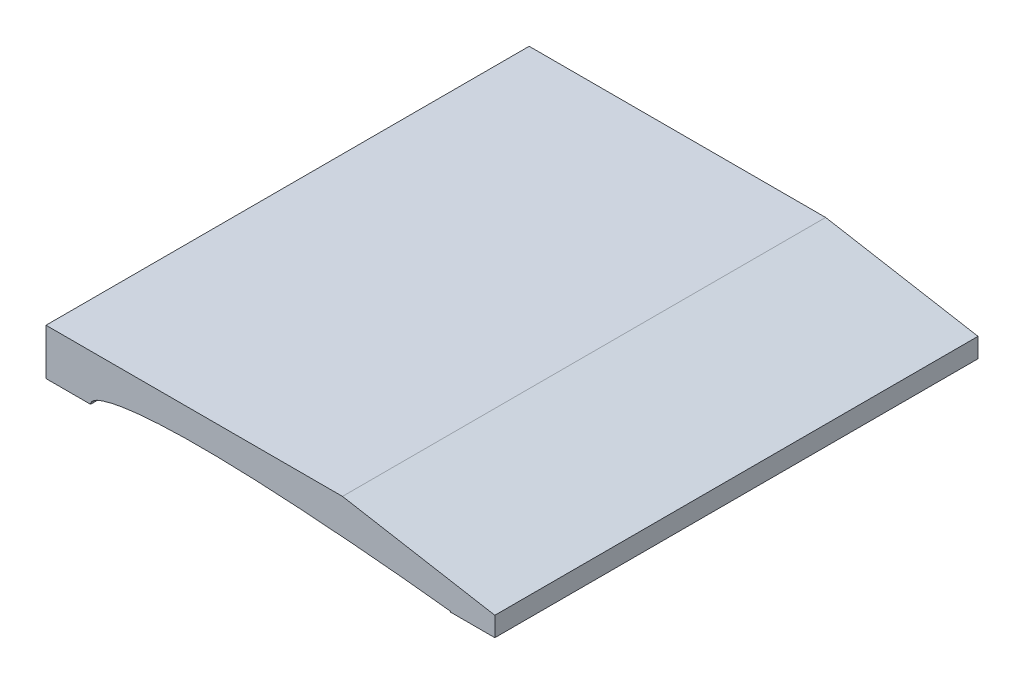
ISO-10303-21;
HEADER;
FILE_DESCRIPTION(('STEP AP214'),'2;1');
FILE_NAME('part.step','',(''),(''),'','','');
FILE_SCHEMA(('AUTOMOTIVE_DESIGN { 1 0 10303 214 1 1 1 1 }'));
ENDSEC;
DATA;
#1=APPLICATION_CONTEXT('core data for automotive mechanical design processes');
#2=APPLICATION_PROTOCOL_DEFINITION('international standard','automotive_design',2000,#1);
#3=PRODUCT_CONTEXT('',#1,'mechanical');
#4=PRODUCT('Part','Part','',(#3));
#5=PRODUCT_RELATED_PRODUCT_CATEGORY('part','',(#4));
#6=PRODUCT_DEFINITION_FORMATION('','',#4);
#7=PRODUCT_DEFINITION_CONTEXT('part definition',#1,'design');
#8=PRODUCT_DEFINITION('design','',#6,#7);
#9=PRODUCT_DEFINITION_SHAPE('','',#8);
#10=(LENGTH_UNIT() NAMED_UNIT(*) SI_UNIT(.MILLI.,.METRE.));
#11=(NAMED_UNIT(*) PLANE_ANGLE_UNIT() SI_UNIT($,.RADIAN.));
#12=(NAMED_UNIT(*) SI_UNIT($,.STERADIAN.) SOLID_ANGLE_UNIT());
#13=UNCERTAINTY_MEASURE_WITH_UNIT(LENGTH_MEASURE(1.E-05),#10,'distance_accuracy_value','');
#14=(GEOMETRIC_REPRESENTATION_CONTEXT(3) GLOBAL_UNCERTAINTY_ASSIGNED_CONTEXT((#13)) GLOBAL_UNIT_ASSIGNED_CONTEXT((#10,
#11,#12)) REPRESENTATION_CONTEXT('',''));
#15=CARTESIAN_POINT('',(0.,0.,0.));
#16=DIRECTION('',(0.,0.,1.));
#17=DIRECTION('',(1.,0.,0.));
#18=AXIS2_PLACEMENT_3D('',#15,#16,#17);
#19=CARTESIAN_POINT('',(0.,0.,0.));
#20=DIRECTION('',(0.,1.,0.));
#21=DIRECTION('',(0.,0.,1.));
#22=AXIS2_PLACEMENT_3D('',#19,#20,#21);
#23=PLANE('',#22);
#24=DIRECTION('',(-1.,0.,0.));
#25=VECTOR('',#24,1.);
#26=CARTESIAN_POINT('',(0.,0.,111.76));
#27=LINE('',#26,#25);
#28=CARTESIAN_POINT('',(0.,0.,111.76));
#29=VERTEX_POINT('',#28);
#30=CARTESIAN_POINT('',(-20.6095999425149,0.,111.76));
#31=VERTEX_POINT('',#30);
#32=EDGE_CURVE('E180',#29,#31,#27,.T.);
#33=ORIENTED_EDGE('',*,*,#32,.F.);
#34=DIRECTION('',(0.,0.,-1.));
#35=VECTOR('',#34,1.);
#36=CARTESIAN_POINT('',(0.,0.,335.28));
#37=LINE('',#36,#35);
#38=CARTESIAN_POINT('',(0.,0.,335.28));
#39=VERTEX_POINT('',#38);
#40=EDGE_CURVE('E51',#29,#39,#37,.F.);
#41=ORIENTED_EDGE('',*,*,#40,.T.);
#42=DIRECTION('',(1.,0.,0.));
#43=VECTOR('',#42,1.);
#44=CARTESIAN_POINT('',(-0.609598885461533,0.,335.28));
#45=LINE('',#44,#43);
#46=CARTESIAN_POINT('',(-20.6095999425149,0.,335.28));
#47=VERTEX_POINT('',#46);
#48=EDGE_CURVE('E199',#47,#39,#45,.T.);
#49=ORIENTED_EDGE('',*,*,#48,.F.);
#50=DIRECTION('',(0.,0.,1.));
#51=VECTOR('',#50,1.);
#52=CARTESIAN_POINT('',(-20.6095999425149,0.,335.28));
#53=LINE('',#52,#51);
#54=EDGE_CURVE('E46',#31,#47,#53,.T.);
#55=ORIENTED_EDGE('',*,*,#54,.F.);
#56=EDGE_LOOP('',(#33,#41,#49,#55));
#57=FACE_BOUND('',#56,.T.);
#58=ADVANCED_FACE('F43',(#57),#23,.F.);
#59=DIRECTION('',(0.,0.,-1.));
#60=VECTOR('',#59,1.);
#61=CARTESIAN_POINT('',(187.03040045645,0.,335.28));
#62=LINE('',#61,#60);
#63=CARTESIAN_POINT('',(187.03040045645,0.,335.28));
#64=VERTEX_POINT('',#63);
#65=CARTESIAN_POINT('',(187.03040045645,0.,111.76));
#66=VERTEX_POINT('',#65);
#67=EDGE_CURVE('E185',#64,#66,#62,.T.);
#68=ORIENTED_EDGE('',*,*,#67,.F.);
#69=CARTESIAN_POINT('',(166.4208,0.,335.28));
#70=VERTEX_POINT('',#69);
#71=EDGE_CURVE('E114',#70,#64,#45,.T.);
#72=ORIENTED_EDGE('',*,*,#71,.F.);
#73=DIRECTION('',(0.,0.,-1.));
#74=VECTOR('',#73,1.);
#75=CARTESIAN_POINT('',(166.4208,0.,335.28));
#76=LINE('',#75,#74);
#77=CARTESIAN_POINT('',(166.4208,0.,111.76));
#78=VERTEX_POINT('',#77);
#79=EDGE_CURVE('E11',#70,#78,#76,.T.);
#80=ORIENTED_EDGE('',*,*,#79,.T.);
#81=EDGE_CURVE('E65',#66,#78,#27,.T.);
#82=ORIENTED_EDGE('',*,*,#81,.F.);
#83=EDGE_LOOP('',(#68,#72,#80,#82));
#84=FACE_BOUND('',#83,.T.);
#85=ADVANCED_FACE('F164',(#84),#23,.F.);
#86=CARTESIAN_POINT('',(0.,0.,111.76));
#87=DIRECTION('',(0.,0.,1.));
#88=DIRECTION('',(1.,0.,0.));
#89=AXIS2_PLACEMENT_3D('',#86,#87,#88);
#90=PLANE('',#89);
#91=DIRECTION('',(0.,1.,0.));
#92=VECTOR('',#91,1.);
#93=CARTESIAN_POINT('',(187.03040045645,-9.00010839719283,111.76));
#94=LINE('',#93,#92);
#95=CARTESIAN_POINT('',(187.03040045645,8.99989160280717,111.76));
#96=VERTEX_POINT('',#95);
#97=EDGE_CURVE('E122',#66,#96,#94,.T.);
#98=ORIENTED_EDGE('',*,*,#97,.F.);
#99=ORIENTED_EDGE('',*,*,#81,.T.);
#100=DIRECTION('',(-0.00105877258486888,0.99999943950015,0.));
#101=VECTOR('',#100,1.);
#102=CARTESIAN_POINT('',(166.4208,0.,111.76));
#103=LINE('',#102,#101);
#104=CARTESIAN_POINT('',(166.420429976466,0.349483289852288,111.76));
#105=VERTEX_POINT('',#104);
#106=EDGE_CURVE('E189',#78,#105,#103,.T.);
#107=ORIENTED_EDGE('',*,*,#106,.T.);
#108=CARTESIAN_POINT('',(166.420429976466,0.349483289852288,111.76));
#109=CARTESIAN_POINT('',(163.646831454691,0.664813727515861,111.76));
#110=CARTESIAN_POINT('',(158.101566411567,1.29525495369924,111.76));
#111=CARTESIAN_POINT('',(147.008165897361,2.46588937833277,111.76));
#112=CARTESIAN_POINT('',(133.141298906875,3.81016103591008,111.76));
#113=CARTESIAN_POINT('',(116.496661416366,5.23272256615442,111.76));
#114=CARTESIAN_POINT('',(99.853604455478,6.47138425314777,111.76));
#115=CARTESIAN_POINT('',(83.2103935136026,7.4779613519339,111.76));
#116=CARTESIAN_POINT('',(66.5664070421306,8.18907766334002,111.76));
#117=CARTESIAN_POINT('',(52.6917156571543,8.42929147742264,111.76));
#118=CARTESIAN_POINT('',(41.5942777294438,8.3167110123386,111.76));
#119=CARTESIAN_POINT('',(33.2695315058996,8.03407215097772,111.76));
#120=CARTESIAN_POINT('',(24.9391270384117,7.49684061618674,111.76));
#121=CARTESIAN_POINT('',(18.0027637880253,6.75347607320088,111.76));
#122=CARTESIAN_POINT('',(12.4523036533551,5.86521596796209,111.76));
#123=CARTESIAN_POINT('',(8.28080999528906,4.9991671637374,111.76));
#124=CARTESIAN_POINT('',(4.73444352038147,3.90067166167619,111.76));
#125=CARTESIAN_POINT('',(1.79365547492393,2.65906643852797,111.76));
#126=CARTESIAN_POINT('',(-1.06378026025538,-0.00258634055295492,111.76));
#127=CARTESIAN_POINT('',(1.79928523538348,-2.65818240636408,111.76));
#128=CARTESIAN_POINT('',(4.74269584126722,-3.89355759780422,111.76));
#129=CARTESIAN_POINT('',(8.29138047776612,-4.98454105004975,111.76));
#130=CARTESIAN_POINT('',(12.4646986797828,-5.84175459129874,111.76));
#131=CARTESIAN_POINT('',(18.0170273001693,-6.71825936159891,111.76));
#132=CARTESIAN_POINT('',(24.9549491063529,-7.44693418369828,111.76));
#133=CARTESIAN_POINT('',(33.2864725084882,-7.96652451616149,111.76));
#134=CARTESIAN_POINT('',(41.6117985681818,-8.23153472757151,111.76));
#135=CARTESIAN_POINT('',(52.7094500095365,-8.3206156273408,111.76));
#136=CARTESIAN_POINT('',(66.5836016241551,-8.05102208256032,111.76));
#137=CARTESIAN_POINT('',(83.2260449597634,-7.30466299207187,111.76));
#138=CARTESIAN_POINT('',(99.8670871163015,-6.26284541884414,111.76));
#139=CARTESIAN_POINT('',(116.507483842874,-4.98894410380409,111.76));
#140=CARTESIAN_POINT('',(133.149071679517,-3.53114001097512,111.76));
#141=CARTESIAN_POINT('',(147.013061026145,-2.15750766649591,111.76));
#142=CARTESIAN_POINT('',(158.103957799079,-0.963385102914492,111.76));
#143=CARTESIAN_POINT('',(163.6478754227,-0.321202947553914,111.76));
#144=CARTESIAN_POINT('',(166.4208,0.,111.76));
#145=B_SPLINE_CURVE_WITH_KNOTS('',3,(#108,#109,#110,#111,#112,#113,#114,#115,#116,#117,#118,
#119,#120,#121,#122,#123,#124,#125,#126,#127,#128,#129,#130,#131,#132,#133,#134,#135,#136,#137,
#138,#139,#140,#141,#142,#143,#144),.UNSPECIFIED.,.F.,.F.,(4,1,1,1,1,1,1,1,1,1,1,1,1,1,1,1,1,1,
1,1,1,1,1,1,1,1,1,1,1,1,1,1,1,1,4),(0.,0.0248235560251693,0.0496298207515118,0.0991970800533457,
0.148712652883516,0.198182139774083,0.247604472837194,0.296979942928689,0.34631759583347,
0.370984298169999,0.395664019787251,0.420382181676291,0.445198050680487,0.457689209223658,
0.470304282792856,0.483229229601925,0.4900691736526,0.5,0.5099308263474,0.516770770398075,
0.529695717207144,0.542310790776342,0.554801949319513,0.579617818323709,0.604335980212749,
0.629015701830001,0.65368240416653,0.703020057071311,0.752395527162806,0.801817860225916,
0.851287347116484,0.900802919946654,0.950370179248488,0.975176443974831,1.),.UNSPECIFIED.);
#146=EDGE_CURVE('E188',#105,#29,#145,.T.);
#147=ORIENTED_EDGE('',*,*,#146,.T.);
#148=ORIENTED_EDGE('',*,*,#32,.T.);
#149=DIRECTION('',(0.,-1.,0.));
#150=VECTOR('',#149,1.);
#151=CARTESIAN_POINT('',(-20.6095999425149,21.3826277919261,111.76));
#152=LINE('',#151,#150);
#153=CARTESIAN_POINT('',(-20.6095999425149,21.3826277919261,111.76));
#154=VERTEX_POINT('',#153);
#155=EDGE_CURVE('E207',#154,#31,#152,.T.);
#156=ORIENTED_EDGE('',*,*,#155,.F.);
#157=DIRECTION('',(-1.,0.,0.));
#158=VECTOR('',#157,1.);
#159=CARTESIAN_POINT('',(-20.6095999425149,21.3826277919261,111.76));
#160=LINE('',#159,#158);
#161=CARTESIAN_POINT('',(116.550400057485,21.3826277919261,111.76));
#162=VERTEX_POINT('',#161);
#163=EDGE_CURVE('E205',#162,#154,#160,.T.);
#164=ORIENTED_EDGE('',*,*,#163,.F.);
#165=DIRECTION('',(-0.984914602057077,0.173041112614168,0.));
#166=VECTOR('',#165,1.);
#167=CARTESIAN_POINT('',(116.550400057485,21.3826277919261,111.76));
#168=LINE('',#167,#166);
#169=EDGE_CURVE('E194',#96,#162,#168,.T.);
#170=ORIENTED_EDGE('',*,*,#169,.F.);
#171=EDGE_LOOP('',(#98,#99,#107,#147,#148,#156,#164,#170));
#172=FACE_BOUND('',#171,.T.);
#173=ADVANCED_FACE('F162',(#172),#90,.F.);
#174=CARTESIAN_POINT('',(187.03040045645,-9.00010839719283,335.28));
#175=DIRECTION('',(-1.,0.,0.));
#176=DIRECTION('',(0.,0.,1.));
#177=AXIS2_PLACEMENT_3D('',#174,#175,#176);
#178=PLANE('',#177);
#179=DIRECTION('',(0.,1.,0.));
#180=VECTOR('',#179,1.);
#181=CARTESIAN_POINT('',(187.03040045645,-9.00010839719283,335.28));
#182=LINE('',#181,#180);
#183=CARTESIAN_POINT('',(187.03040045645,8.99989160280717,335.28));
#184=VERTEX_POINT('',#183);
#185=EDGE_CURVE('E106',#64,#184,#182,.T.);
#186=ORIENTED_EDGE('',*,*,#185,.F.);
#187=ORIENTED_EDGE('',*,*,#67,.T.);
#188=ORIENTED_EDGE('',*,*,#97,.T.);
#189=DIRECTION('',(0.,0.,-1.));
#190=VECTOR('',#189,1.);
#191=CARTESIAN_POINT('',(187.03040045645,8.99989160280717,335.28));
#192=LINE('',#191,#190);
#193=EDGE_CURVE('E120',#184,#96,#192,.T.);
#194=ORIENTED_EDGE('',*,*,#193,.F.);
#195=EDGE_LOOP('',(#186,#187,#188,#194));
#196=FACE_BOUND('',#195,.T.);
#197=ADVANCED_FACE('F121',(#196),#178,.F.);
#198=CARTESIAN_POINT('',(116.550400057485,21.3826277919261,335.28));
#199=DIRECTION('',(-0.173041112614168,-0.984914602057077,0.));
#200=DIRECTION('',(0.984914602057077,-0.173041112614168,0.));
#201=AXIS2_PLACEMENT_3D('',#198,#199,#200);
#202=PLANE('',#201);
#203=ORIENTED_EDGE('',*,*,#193,.T.);
#204=ORIENTED_EDGE('',*,*,#169,.T.);
#205=DIRECTION('',(0.,0.,-1.));
#206=VECTOR('',#205,1.);
#207=CARTESIAN_POINT('',(116.550400057485,21.3826277919261,335.28));
#208=LINE('',#207,#206);
#209=CARTESIAN_POINT('',(116.550400057485,21.3826277919261,335.28));
#210=VERTEX_POINT('',#209);
#211=EDGE_CURVE('E126',#210,#162,#208,.T.);
#212=ORIENTED_EDGE('',*,*,#211,.F.);
#213=DIRECTION('',(-0.984914602057077,0.173041112614168,0.));
#214=VECTOR('',#213,1.);
#215=CARTESIAN_POINT('',(116.550400057485,21.3826277919261,335.28));
#216=LINE('',#215,#214);
#217=EDGE_CURVE('E111',#184,#210,#216,.T.);
#218=ORIENTED_EDGE('',*,*,#217,.F.);
#219=EDGE_LOOP('',(#203,#204,#212,#218));
#220=FACE_BOUND('',#219,.T.);
#221=ADVANCED_FACE('F128',(#220),#202,.F.);
#222=CARTESIAN_POINT('',(-0.609598885461533,-0.0021054654935638,335.28));
#223=DIRECTION('',(0.,0.,-1.));
#224=DIRECTION('',(-1.,0.,0.));
#225=AXIS2_PLACEMENT_3D('',#222,#223,#224);
#226=PLANE('',#225);
#227=DIRECTION('',(0.,-1.,0.));
#228=VECTOR('',#227,1.);
#229=CARTESIAN_POINT('',(-20.6095999425149,21.3826277919261,335.28));
#230=LINE('',#229,#228);
#231=CARTESIAN_POINT('',(-20.6095999425149,21.3826277919261,335.28));
#232=VERTEX_POINT('',#231);
#233=EDGE_CURVE('E133',#232,#47,#230,.T.);
#234=ORIENTED_EDGE('',*,*,#233,.T.);
#235=ORIENTED_EDGE('',*,*,#48,.T.);
#236=CARTESIAN_POINT('',(166.420429976466,0.349483289852288,335.28));
#237=CARTESIAN_POINT('',(163.646831454691,0.664813727515861,335.28));
#238=CARTESIAN_POINT('',(158.101566411567,1.29525495369924,335.28));
#239=CARTESIAN_POINT('',(147.008165897361,2.46588937833277,335.28));
#240=CARTESIAN_POINT('',(133.141298906875,3.81016103591008,335.28));
#241=CARTESIAN_POINT('',(116.496661416366,5.23272256615442,335.28));
#242=CARTESIAN_POINT('',(99.853604455478,6.47138425314777,335.28));
#243=CARTESIAN_POINT('',(83.2103935136026,7.4779613519339,335.28));
#244=CARTESIAN_POINT('',(66.5664070421306,8.18907766334002,335.28));
#245=CARTESIAN_POINT('',(52.6917156571543,8.42929147742264,335.28));
#246=CARTESIAN_POINT('',(41.5942777294438,8.3167110123386,335.28));
#247=CARTESIAN_POINT('',(33.2695315058996,8.03407215097772,335.28));
#248=CARTESIAN_POINT('',(24.9391270384117,7.49684061618674,335.28));
#249=CARTESIAN_POINT('',(18.0027637880253,6.75347607320088,335.28));
#250=CARTESIAN_POINT('',(12.4523036533551,5.86521596796209,335.28));
#251=CARTESIAN_POINT('',(8.28080999528906,4.9991671637374,335.28));
#252=CARTESIAN_POINT('',(4.73444352038147,3.90067166167619,335.28));
#253=CARTESIAN_POINT('',(1.79365547492393,2.65906643852797,335.28));
#254=CARTESIAN_POINT('',(-1.06378026025538,-0.00258634055295492,335.28));
#255=CARTESIAN_POINT('',(1.79928523538348,-2.65818240636408,335.28));
#256=CARTESIAN_POINT('',(4.74269584126722,-3.89355759780422,335.28));
#257=CARTESIAN_POINT('',(8.29138047776612,-4.98454105004975,335.28));
#258=CARTESIAN_POINT('',(12.4646986797828,-5.84175459129874,335.28));
#259=CARTESIAN_POINT('',(18.0170273001693,-6.71825936159891,335.28));
#260=CARTESIAN_POINT('',(24.9549491063529,-7.44693418369828,335.28));
#261=CARTESIAN_POINT('',(33.2864725084882,-7.96652451616149,335.28));
#262=CARTESIAN_POINT('',(41.6117985681818,-8.23153472757151,335.28));
#263=CARTESIAN_POINT('',(52.7094500095365,-8.3206156273408,335.28));
#264=CARTESIAN_POINT('',(66.5836016241551,-8.05102208256032,335.28));
#265=CARTESIAN_POINT('',(83.2260449597634,-7.30466299207187,335.28));
#266=CARTESIAN_POINT('',(99.8670871163015,-6.26284541884414,335.28));
#267=CARTESIAN_POINT('',(116.507483842874,-4.98894410380409,335.28));
#268=CARTESIAN_POINT('',(133.149071679517,-3.53114001097512,335.28));
#269=CARTESIAN_POINT('',(147.013061026145,-2.15750766649591,335.28));
#270=CARTESIAN_POINT('',(158.103957799079,-0.963385102914492,335.28));
#271=CARTESIAN_POINT('',(163.6478754227,-0.321202947553914,335.28));
#272=CARTESIAN_POINT('',(166.4208,0.,335.28));
#273=B_SPLINE_CURVE_WITH_KNOTS('',3,(#236,#237,#238,#239,#240,#241,#242,#243,#244,#245,#246,
#247,#248,#249,#250,#251,#252,#253,#254,#255,#256,#257,#258,#259,#260,#261,#262,#263,#264,#265,
#266,#267,#268,#269,#270,#271,#272),.UNSPECIFIED.,.F.,.F.,(4,1,1,1,1,1,1,1,1,1,1,1,1,1,1,1,1,1,
1,1,1,1,1,1,1,1,1,1,1,1,1,1,1,1,4),(0.,0.0248235560251693,0.0496298207515118,0.0991970800533457,
0.148712652883516,0.198182139774083,0.247604472837194,0.296979942928689,0.34631759583347,
0.370984298169999,0.395664019787251,0.420382181676291,0.445198050680487,0.457689209223658,
0.470304282792856,0.483229229601925,0.4900691736526,0.5,0.5099308263474,0.516770770398075,
0.529695717207144,0.542310790776342,0.554801949319513,0.579617818323709,0.604335980212749,
0.629015701830001,0.65368240416653,0.703020057071311,0.752395527162806,0.801817860225916,
0.851287347116484,0.900802919946654,0.950370179248488,0.975176443974831,1.),.UNSPECIFIED.);
#274=CARTESIAN_POINT('',(166.420429976466,0.349483289852288,335.28));
#275=VERTEX_POINT('',#274);
#276=EDGE_CURVE('E125',#275,#39,#273,.T.);
#277=ORIENTED_EDGE('',*,*,#276,.F.);
#278=DIRECTION('',(-0.00105877258486888,0.99999943950015,0.));
#279=VECTOR('',#278,1.);
#280=CARTESIAN_POINT('',(166.4208,0.,335.28));
#281=LINE('',#280,#279);
#282=EDGE_CURVE('E146',#70,#275,#281,.T.);
#283=ORIENTED_EDGE('',*,*,#282,.F.);
#284=ORIENTED_EDGE('',*,*,#71,.T.);
#285=ORIENTED_EDGE('',*,*,#185,.T.);
#286=ORIENTED_EDGE('',*,*,#217,.T.);
#287=DIRECTION('',(-1.,0.,0.));
#288=VECTOR('',#287,1.);
#289=CARTESIAN_POINT('',(-20.6095999425149,21.3826277919261,335.28));
#290=LINE('',#289,#288);
#291=EDGE_CURVE('E131',#210,#232,#290,.T.);
#292=ORIENTED_EDGE('',*,*,#291,.T.);
#293=EDGE_LOOP('',(#234,#235,#277,#283,#284,#285,#286,#292));
#294=FACE_BOUND('',#293,.T.);
#295=ADVANCED_FACE('F109',(#294),#226,.F.);
#296=CARTESIAN_POINT('',(-20.6095999425149,21.3826277919261,335.28));
#297=DIRECTION('',(0.,-1.,0.));
#298=DIRECTION('',(0.,0.,-1.));
#299=AXIS2_PLACEMENT_3D('',#296,#297,#298);
#300=PLANE('',#299);
#301=ORIENTED_EDGE('',*,*,#211,.T.);
#302=ORIENTED_EDGE('',*,*,#163,.T.);
#303=DIRECTION('',(0.,0.,-1.));
#304=VECTOR('',#303,1.);
#305=CARTESIAN_POINT('',(-20.6095999425149,21.3826277919261,335.28));
#306=LINE('',#305,#304);
#307=EDGE_CURVE('E137',#232,#154,#306,.T.);
#308=ORIENTED_EDGE('',*,*,#307,.F.);
#309=ORIENTED_EDGE('',*,*,#291,.F.);
#310=EDGE_LOOP('',(#301,#302,#308,#309));
#311=FACE_BOUND('',#310,.T.);
#312=ADVANCED_FACE('F161',(#311),#300,.F.);
#313=CARTESIAN_POINT('',(-20.6095999425149,21.3826277919261,335.28));
#314=DIRECTION('',(1.,0.,0.));
#315=DIRECTION('',(0.,0.,-1.));
#316=AXIS2_PLACEMENT_3D('',#313,#314,#315);
#317=PLANE('',#316);
#318=ORIENTED_EDGE('',*,*,#155,.T.);
#319=ORIENTED_EDGE('',*,*,#54,.T.);
#320=ORIENTED_EDGE('',*,*,#233,.F.);
#321=ORIENTED_EDGE('',*,*,#307,.T.);
#322=EDGE_LOOP('',(#318,#319,#320,#321));
#323=FACE_BOUND('',#322,.T.);
#324=ADVANCED_FACE('F157',(#323),#317,.F.);
#325=DIRECTION('',(0.,0.,-1.));
#326=VECTOR('',#325,1.);
#327=SURFACE_OF_LINEAR_EXTRUSION('',#273,#326);
#328=ORIENTED_EDGE('',*,*,#40,.F.);
#329=ORIENTED_EDGE('',*,*,#146,.F.);
#330=DIRECTION('',(0.,0.,-1.));
#331=VECTOR('',#330,1.);
#332=CARTESIAN_POINT('',(166.420429976466,0.349483289852288,335.28));
#333=LINE('',#332,#331);
#334=EDGE_CURVE('E210',#275,#105,#333,.T.);
#335=ORIENTED_EDGE('',*,*,#334,.F.);
#336=ORIENTED_EDGE('',*,*,#276,.T.);
#337=EDGE_LOOP('',(#328,#329,#335,#336));
#338=FACE_BOUND('',#337,.T.);
#339=ADVANCED_FACE('F152',(#338),#327,.T.);
#340=CARTESIAN_POINT('',(166.4208,0.,335.28));
#341=DIRECTION('',(-0.99999943950015,-0.00105877258486888,0.));
#342=DIRECTION('',(0.00105877258486888,-0.99999943950015,0.));
#343=AXIS2_PLACEMENT_3D('',#340,#341,#342);
#344=PLANE('',#343);
#345=ORIENTED_EDGE('',*,*,#106,.F.);
#346=ORIENTED_EDGE('',*,*,#79,.F.);
#347=ORIENTED_EDGE('',*,*,#282,.T.);
#348=ORIENTED_EDGE('',*,*,#334,.T.);
#349=EDGE_LOOP('',(#345,#346,#347,#348));
#350=FACE_BOUND('',#349,.T.);
#351=ADVANCED_FACE('F156',(#350),#344,.T.);
#352=CLOSED_SHELL('',(#58,#85,#173,#197,#221,#295,#312,#324,#339,#351));
#353=MANIFOLD_SOLID_BREP('B2',#352);
#354=ADVANCED_BREP_SHAPE_REPRESENTATION('',(#18,#353),#14);
#355=SHAPE_DEFINITION_REPRESENTATION(#9,#354);
ENDSEC;
END-ISO-10303-21;
